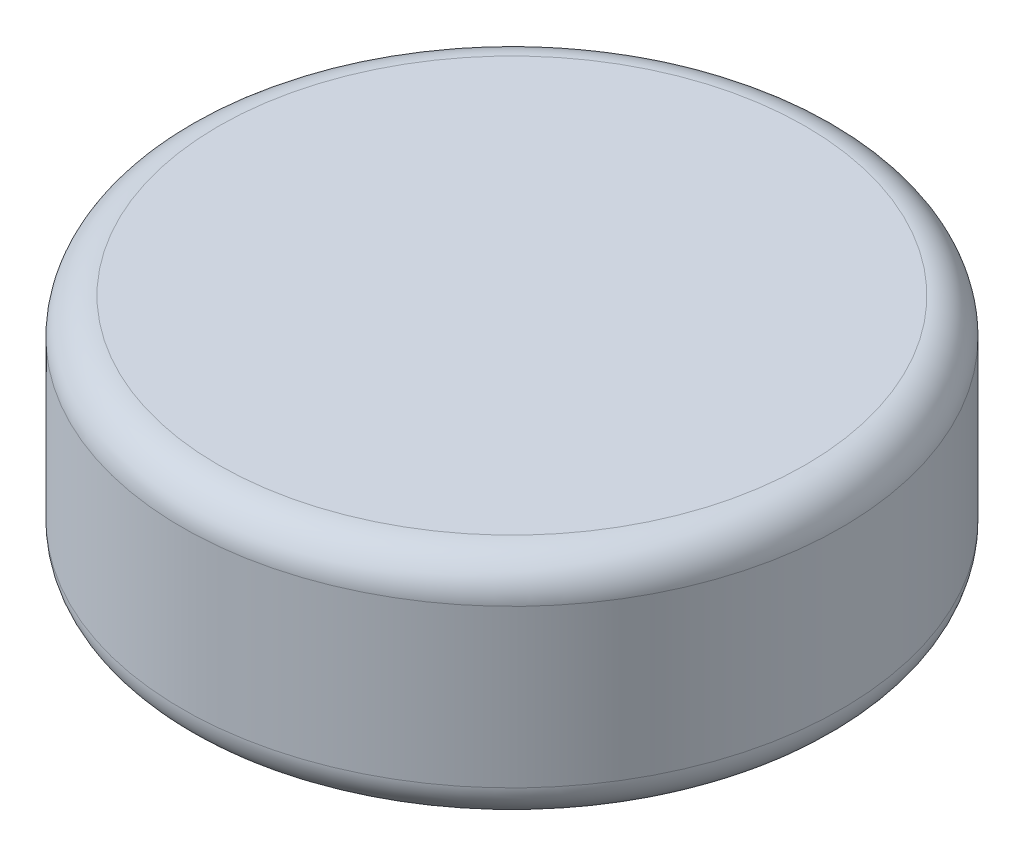
ISO-10303-21;
HEADER;
FILE_DESCRIPTION(('STEP AP214'),'2;1');
FILE_NAME('part.step','',(''),(''),'','','');
FILE_SCHEMA(('AUTOMOTIVE_DESIGN { 1 0 10303 214 1 1 1 1 }'));
ENDSEC;
DATA;
#1=APPLICATION_CONTEXT('core data for automotive mechanical design processes');
#2=APPLICATION_PROTOCOL_DEFINITION('international standard','automotive_design',2000,#1);
#3=PRODUCT_CONTEXT('',#1,'mechanical');
#4=PRODUCT('Part','Part','',(#3));
#5=PRODUCT_RELATED_PRODUCT_CATEGORY('part','',(#4));
#6=PRODUCT_DEFINITION_FORMATION('','',#4);
#7=PRODUCT_DEFINITION_CONTEXT('part definition',#1,'design');
#8=PRODUCT_DEFINITION('design','',#6,#7);
#9=PRODUCT_DEFINITION_SHAPE('','',#8);
#10=(LENGTH_UNIT() NAMED_UNIT(*) SI_UNIT(.MILLI.,.METRE.));
#11=(NAMED_UNIT(*) PLANE_ANGLE_UNIT() SI_UNIT($,.RADIAN.));
#12=(NAMED_UNIT(*) SI_UNIT($,.STERADIAN.) SOLID_ANGLE_UNIT());
#13=UNCERTAINTY_MEASURE_WITH_UNIT(LENGTH_MEASURE(1.E-05),#10,'distance_accuracy_value','');
#14=(GEOMETRIC_REPRESENTATION_CONTEXT(3) GLOBAL_UNCERTAINTY_ASSIGNED_CONTEXT((#13)) GLOBAL_UNIT_ASSIGNED_CONTEXT((#10,
#11,#12)) REPRESENTATION_CONTEXT('',''));
#15=CARTESIAN_POINT('',(0.,0.,0.));
#16=DIRECTION('',(0.,0.,1.));
#17=DIRECTION('',(1.,0.,0.));
#18=AXIS2_PLACEMENT_3D('',#15,#16,#17);
#19=CARTESIAN_POINT('',(0.,0.,0.));
#20=DIRECTION('',(0.,-1.,0.));
#21=DIRECTION('',(0.,0.,-1.));
#22=AXIS2_PLACEMENT_3D('',#19,#20,#21);
#23=PLANE('',#22);
#24=CARTESIAN_POINT('',(0.,0.,0.));
#25=DIRECTION('',(0.,-1.,0.));
#26=DIRECTION('',(0.,0.,-1.));
#27=AXIS2_PLACEMENT_3D('',#24,#25,#26);
#28=CIRCLE('',#27,16.236891766918);
#29=CARTESIAN_POINT('',(0.,0.,-16.236891766918));
#30=VERTEX_POINT('',#29);
#31=EDGE_CURVE('E10',#30,#30,#28,.T.);
#32=ORIENTED_EDGE('',*,*,#31,.T.);
#33=EDGE_LOOP('',(#32));
#34=FACE_BOUND('',#33,.T.);
#35=ADVANCED_FACE('F31',(#34),#23,.T.);
#36=CARTESIAN_POINT('',(0.,2.,0.));
#37=DIRECTION('',(0.,-1.,0.));
#38=DIRECTION('',(0.,0.,-1.));
#39=AXIS2_PLACEMENT_3D('',#36,#37,#38);
#40=TOROIDAL_SURFACE('',#39,16.236891766918,2.);
#41=CARTESIAN_POINT('',(0.,2.,0.));
#42=DIRECTION('',(0.,-1.,0.));
#43=DIRECTION('',(0.,0.,-1.));
#44=AXIS2_PLACEMENT_3D('',#41,#42,#43);
#45=CIRCLE('',#44,18.236891766918);
#46=CARTESIAN_POINT('',(0.,2.,-18.236891766918));
#47=VERTEX_POINT('',#46);
#48=EDGE_CURVE('E37',#47,#47,#45,.T.);
#49=ORIENTED_EDGE('',*,*,#48,.T.);
#50=EDGE_LOOP('',(#49));
#51=FACE_BOUND('',#50,.T.);
#52=ORIENTED_EDGE('',*,*,#31,.F.);
#53=EDGE_LOOP('',(#52));
#54=FACE_BOUND('',#53,.T.);
#55=ADVANCED_FACE('F63',(#51,#54),#40,.T.);
#56=CARTESIAN_POINT('',(0.,0.,0.));
#57=DIRECTION('',(0.,-1.,0.));
#58=DIRECTION('',(0.,0.,-1.));
#59=AXIS2_PLACEMENT_3D('',#56,#57,#58);
#60=CYLINDRICAL_SURFACE('',#59,18.236891766918);
#61=CARTESIAN_POINT('',(0.,10.699432043334,0.));
#62=DIRECTION('',(0.,-1.,0.));
#63=DIRECTION('',(0.,0.,-1.));
#64=AXIS2_PLACEMENT_3D('',#61,#62,#63);
#65=CIRCLE('',#64,18.236891766918);
#66=CARTESIAN_POINT('',(0.,10.699432043334,-18.236891766918));
#67=VERTEX_POINT('',#66);
#68=EDGE_CURVE('E41',#67,#67,#65,.T.);
#69=ORIENTED_EDGE('',*,*,#68,.T.);
#70=EDGE_LOOP('',(#69));
#71=FACE_BOUND('',#70,.T.);
#72=ORIENTED_EDGE('',*,*,#48,.F.);
#73=EDGE_LOOP('',(#72));
#74=FACE_BOUND('',#73,.T.);
#75=ADVANCED_FACE('F60',(#71,#74),#60,.T.);
#76=CARTESIAN_POINT('',(0.,10.699432043334,0.));
#77=DIRECTION('',(0.,-1.,0.));
#78=DIRECTION('',(0.,0.,-1.));
#79=AXIS2_PLACEMENT_3D('',#76,#77,#78);
#80=TOROIDAL_SURFACE('',#79,16.236891766918,2.);
#81=CARTESIAN_POINT('',(0.,12.699432043334,0.));
#82=DIRECTION('',(0.,-1.,0.));
#83=DIRECTION('',(0.,0.,-1.));
#84=AXIS2_PLACEMENT_3D('',#81,#82,#83);
#85=CIRCLE('',#84,16.236891766918);
#86=CARTESIAN_POINT('',(0.,12.699432043334,-16.236891766918));
#87=VERTEX_POINT('',#86);
#88=EDGE_CURVE('E45',#87,#87,#85,.T.);
#89=ORIENTED_EDGE('',*,*,#88,.T.);
#90=EDGE_LOOP('',(#89));
#91=FACE_BOUND('',#90,.T.);
#92=ORIENTED_EDGE('',*,*,#68,.F.);
#93=EDGE_LOOP('',(#92));
#94=FACE_BOUND('',#93,.T.);
#95=ADVANCED_FACE('F51',(#91,#94),#80,.T.);
#96=CARTESIAN_POINT('',(16.236891766918,12.699432043334,0.));
#97=DIRECTION('',(0.,1.,0.));
#98=DIRECTION('',(0.,0.,1.));
#99=AXIS2_PLACEMENT_3D('',#96,#97,#98);
#100=PLANE('',#99);
#101=ORIENTED_EDGE('',*,*,#88,.F.);
#102=EDGE_LOOP('',(#101));
#103=FACE_BOUND('',#102,.T.);
#104=ADVANCED_FACE('F54',(#103),#100,.T.);
#105=CLOSED_SHELL('',(#35,#55,#75,#95,#104));
#106=MANIFOLD_SOLID_BREP('B2',#105);
#107=ADVANCED_BREP_SHAPE_REPRESENTATION('',(#18,#106),#14);
#108=SHAPE_DEFINITION_REPRESENTATION(#9,#107);
ENDSEC;
END-ISO-10303-21;
